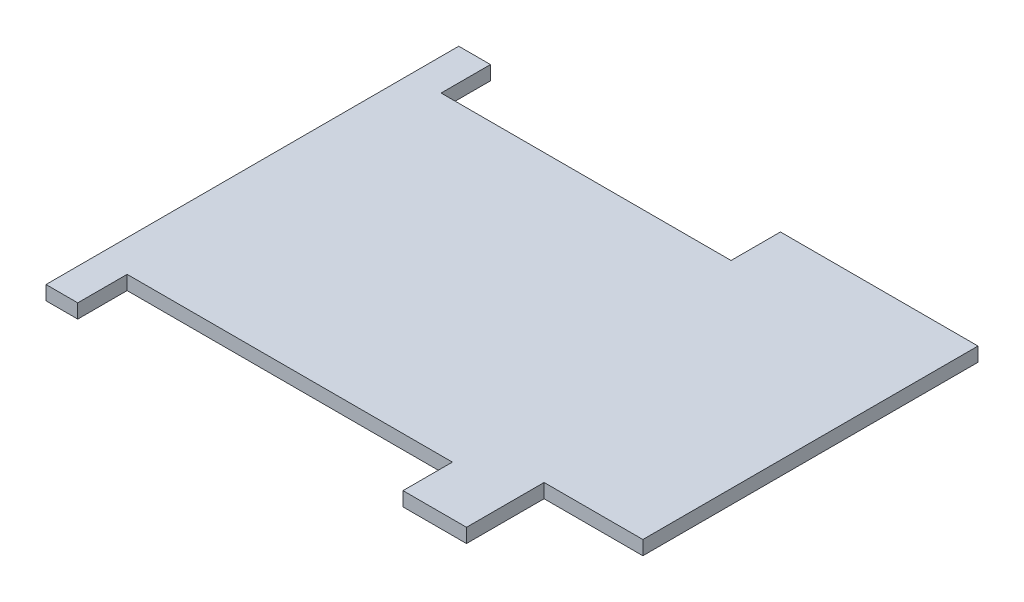
ISO-10303-21;
HEADER;
FILE_DESCRIPTION(('STEP AP214'),'2;1');
FILE_NAME('part.step','',(''),(''),'','','');
FILE_SCHEMA(('AUTOMOTIVE_DESIGN { 1 0 10303 214 1 1 1 1 }'));
ENDSEC;
DATA;
#1=APPLICATION_CONTEXT('core data for automotive mechanical design processes');
#2=APPLICATION_PROTOCOL_DEFINITION('international standard','automotive_design',2000,#1);
#3=PRODUCT_CONTEXT('',#1,'mechanical');
#4=PRODUCT('Part','Part','',(#3));
#5=PRODUCT_RELATED_PRODUCT_CATEGORY('part','',(#4));
#6=PRODUCT_DEFINITION_FORMATION('','',#4);
#7=PRODUCT_DEFINITION_CONTEXT('part definition',#1,'design');
#8=PRODUCT_DEFINITION('design','',#6,#7);
#9=PRODUCT_DEFINITION_SHAPE('','',#8);
#10=(LENGTH_UNIT() NAMED_UNIT(*) SI_UNIT(.MILLI.,.METRE.));
#11=(NAMED_UNIT(*) PLANE_ANGLE_UNIT() SI_UNIT($,.RADIAN.));
#12=(NAMED_UNIT(*) SI_UNIT($,.STERADIAN.) SOLID_ANGLE_UNIT());
#13=UNCERTAINTY_MEASURE_WITH_UNIT(LENGTH_MEASURE(1.E-05),#10,'distance_accuracy_value','');
#14=(GEOMETRIC_REPRESENTATION_CONTEXT(3) GLOBAL_UNCERTAINTY_ASSIGNED_CONTEXT((#13)) GLOBAL_UNIT_ASSIGNED_CONTEXT((#10,
#11,#12)) REPRESENTATION_CONTEXT('',''));
#15=CARTESIAN_POINT('',(0.,0.,0.));
#16=DIRECTION('',(0.,0.,1.));
#17=DIRECTION('',(1.,0.,0.));
#18=AXIS2_PLACEMENT_3D('',#15,#16,#17);
#19=CARTESIAN_POINT('',(0.,2.,58.5));
#20=DIRECTION('',(0.,0.,-1.));
#21=DIRECTION('',(-1.,0.,0.));
#22=AXIS2_PLACEMENT_3D('',#19,#20,#21);
#23=PLANE('',#22);
#24=DIRECTION('',(1.,0.,0.));
#25=VECTOR('',#24,1.);
#26=CARTESIAN_POINT('',(0.,0.,58.5));
#27=LINE('',#26,#25);
#28=CARTESIAN_POINT('',(0.,0.,58.5));
#29=VERTEX_POINT('',#28);
#30=CARTESIAN_POINT('',(4.50000000000001,0.,58.5));
#31=VERTEX_POINT('',#30);
#32=EDGE_CURVE('E151',#29,#31,#27,.T.);
#33=ORIENTED_EDGE('',*,*,#32,.T.);
#34=DIRECTION('',(0.,1.,0.));
#35=VECTOR('',#34,1.);
#36=CARTESIAN_POINT('',(4.50000000000001,0.,58.5));
#37=LINE('',#36,#35);
#38=CARTESIAN_POINT('',(4.50000000000001,2.,58.5));
#39=VERTEX_POINT('',#38);
#40=EDGE_CURVE('E137',#31,#39,#37,.T.);
#41=ORIENTED_EDGE('',*,*,#40,.T.);
#42=DIRECTION('',(1.,0.,0.));
#43=VECTOR('',#42,1.);
#44=CARTESIAN_POINT('',(0.,2.,58.5));
#45=LINE('',#44,#43);
#46=CARTESIAN_POINT('',(0.,2.,58.5));
#47=VERTEX_POINT('',#46);
#48=EDGE_CURVE('E219',#47,#39,#45,.T.);
#49=ORIENTED_EDGE('',*,*,#48,.F.);
#50=DIRECTION('',(0.,-1.,0.));
#51=VECTOR('',#50,1.);
#52=CARTESIAN_POINT('',(0.,2.,58.5));
#53=LINE('',#52,#51);
#54=EDGE_CURVE('E11',#47,#29,#53,.T.);
#55=ORIENTED_EDGE('',*,*,#54,.T.);
#56=EDGE_LOOP('',(#33,#41,#49,#55));
#57=FACE_BOUND('',#56,.T.);
#58=ADVANCED_FACE('F35',(#57),#23,.F.);
#59=CARTESIAN_POINT('',(0.,2.,0.));
#60=DIRECTION('',(0.,0.,1.));
#61=DIRECTION('',(1.,0.,0.));
#62=AXIS2_PLACEMENT_3D('',#59,#60,#61);
#63=PLANE('',#62);
#64=DIRECTION('',(-1.,0.,0.));
#65=VECTOR('',#64,1.);
#66=CARTESIAN_POINT('',(0.,2.,0.));
#67=LINE('',#66,#65);
#68=CARTESIAN_POINT('',(4.5,2.,0.));
#69=VERTEX_POINT('',#68);
#70=CARTESIAN_POINT('',(0.,2.,0.));
#71=VERTEX_POINT('',#70);
#72=EDGE_CURVE('E222',#69,#71,#67,.T.);
#73=ORIENTED_EDGE('',*,*,#72,.F.);
#74=DIRECTION('',(0.,1.,0.));
#75=VECTOR('',#74,1.);
#76=CARTESIAN_POINT('',(4.5,0.,0.));
#77=LINE('',#76,#75);
#78=CARTESIAN_POINT('',(4.5,0.,0.));
#79=VERTEX_POINT('',#78);
#80=EDGE_CURVE('E211',#79,#69,#77,.T.);
#81=ORIENTED_EDGE('',*,*,#80,.F.);
#82=DIRECTION('',(-1.,0.,0.));
#83=VECTOR('',#82,1.);
#84=CARTESIAN_POINT('',(0.,0.,0.));
#85=LINE('',#84,#83);
#86=CARTESIAN_POINT('',(0.,0.,0.));
#87=VERTEX_POINT('',#86);
#88=EDGE_CURVE('E161',#79,#87,#85,.T.);
#89=ORIENTED_EDGE('',*,*,#88,.T.);
#90=DIRECTION('',(0.,-1.,0.));
#91=VECTOR('',#90,1.);
#92=CARTESIAN_POINT('',(0.,2.,0.));
#93=LINE('',#92,#91);
#94=EDGE_CURVE('E171',#71,#87,#93,.T.);
#95=ORIENTED_EDGE('',*,*,#94,.F.);
#96=EDGE_LOOP('',(#73,#81,#89,#95));
#97=FACE_BOUND('',#96,.T.);
#98=ADVANCED_FACE('F233',(#97),#63,.F.);
#99=CARTESIAN_POINT('',(0.,2.,0.));
#100=DIRECTION('',(1.,0.,0.));
#101=DIRECTION('',(0.,0.,-1.));
#102=AXIS2_PLACEMENT_3D('',#99,#100,#101);
#103=PLANE('',#102);
#104=DIRECTION('',(0.,0.,1.));
#105=VECTOR('',#104,1.);
#106=CARTESIAN_POINT('',(0.,0.,0.));
#107=LINE('',#106,#105);
#108=EDGE_CURVE('E163',#87,#29,#107,.T.);
#109=ORIENTED_EDGE('',*,*,#108,.T.);
#110=ORIENTED_EDGE('',*,*,#54,.F.);
#111=DIRECTION('',(0.,0.,1.));
#112=VECTOR('',#111,1.);
#113=CARTESIAN_POINT('',(0.,2.,0.));
#114=LINE('',#113,#112);
#115=EDGE_CURVE('E170',#71,#47,#114,.T.);
#116=ORIENTED_EDGE('',*,*,#115,.F.);
#117=ORIENTED_EDGE('',*,*,#94,.T.);
#118=EDGE_LOOP('',(#109,#110,#116,#117));
#119=FACE_BOUND('',#118,.T.);
#120=ADVANCED_FACE('F37',(#119),#103,.F.);
#121=CARTESIAN_POINT('',(50.6,2.,58.5));
#122=VERTEX_POINT('',#121);
#123=CARTESIAN_POINT('',(59.6,2.,58.5));
#124=VERTEX_POINT('',#123);
#125=EDGE_CURVE('E218',#122,#124,#45,.T.);
#126=ORIENTED_EDGE('',*,*,#125,.F.);
#127=DIRECTION('',(0.,1.,0.));
#128=VECTOR('',#127,1.);
#129=CARTESIAN_POINT('',(50.6,0.,58.5));
#130=LINE('',#129,#128);
#131=CARTESIAN_POINT('',(50.6,0.,58.5));
#132=VERTEX_POINT('',#131);
#133=EDGE_CURVE('E146',#132,#122,#130,.T.);
#134=ORIENTED_EDGE('',*,*,#133,.F.);
#135=CARTESIAN_POINT('',(59.6,0.,58.5));
#136=VERTEX_POINT('',#135);
#137=EDGE_CURVE('E159',#132,#136,#27,.T.);
#138=ORIENTED_EDGE('',*,*,#137,.T.);
#139=DIRECTION('',(0.,1.,0.));
#140=VECTOR('',#139,1.);
#141=CARTESIAN_POINT('',(59.6,0.,58.5));
#142=LINE('',#141,#140);
#143=EDGE_CURVE('E206',#136,#124,#142,.T.);
#144=ORIENTED_EDGE('',*,*,#143,.T.);
#145=EDGE_LOOP('',(#126,#134,#138,#144));
#146=FACE_BOUND('',#145,.T.);
#147=ADVANCED_FACE('F272',(#146),#23,.F.);
#148=CARTESIAN_POINT('',(73.6,2.,0.));
#149=DIRECTION('',(-1.,0.,0.));
#150=DIRECTION('',(0.,0.,1.));
#151=AXIS2_PLACEMENT_3D('',#148,#149,#150);
#152=PLANE('',#151);
#153=DIRECTION('',(0.,0.,-1.));
#154=VECTOR('',#153,1.);
#155=CARTESIAN_POINT('',(73.6,2.,0.));
#156=LINE('',#155,#154);
#157=CARTESIAN_POINT('',(73.6,2.,47.5));
#158=VERTEX_POINT('',#157);
#159=CARTESIAN_POINT('',(73.6,2.,0.));
#160=VERTEX_POINT('',#159);
#161=EDGE_CURVE('E221',#158,#160,#156,.T.);
#162=ORIENTED_EDGE('',*,*,#161,.F.);
#163=DIRECTION('',(0.,1.,0.));
#164=VECTOR('',#163,1.);
#165=CARTESIAN_POINT('',(73.6,0.,47.5));
#166=LINE('',#165,#164);
#167=CARTESIAN_POINT('',(73.6,0.,47.5));
#168=VERTEX_POINT('',#167);
#169=EDGE_CURVE('E238',#168,#158,#166,.T.);
#170=ORIENTED_EDGE('',*,*,#169,.F.);
#171=DIRECTION('',(0.,0.,-1.));
#172=VECTOR('',#171,1.);
#173=CARTESIAN_POINT('',(73.6,0.,0.));
#174=LINE('',#173,#172);
#175=CARTESIAN_POINT('',(73.6,0.,0.));
#176=VERTEX_POINT('',#175);
#177=EDGE_CURVE('E158',#168,#176,#174,.T.);
#178=ORIENTED_EDGE('',*,*,#177,.T.);
#179=DIRECTION('',(0.,-1.,0.));
#180=VECTOR('',#179,1.);
#181=CARTESIAN_POINT('',(73.6,2.,0.));
#182=LINE('',#181,#180);
#183=EDGE_CURVE('E43',#160,#176,#182,.T.);
#184=ORIENTED_EDGE('',*,*,#183,.F.);
#185=EDGE_LOOP('',(#162,#170,#178,#184));
#186=FACE_BOUND('',#185,.T.);
#187=ADVANCED_FACE('F280',(#186),#152,.F.);
#188=CARTESIAN_POINT('',(45.6,0.,0.));
#189=VERTEX_POINT('',#188);
#190=EDGE_CURVE('E167',#176,#189,#85,.T.);
#191=ORIENTED_EDGE('',*,*,#190,.T.);
#192=DIRECTION('',(0.,1.,0.));
#193=VECTOR('',#192,1.);
#194=CARTESIAN_POINT('',(45.6,0.,0.));
#195=LINE('',#194,#193);
#196=CARTESIAN_POINT('',(45.6,2.,0.));
#197=VERTEX_POINT('',#196);
#198=EDGE_CURVE('E213',#189,#197,#195,.T.);
#199=ORIENTED_EDGE('',*,*,#198,.T.);
#200=EDGE_CURVE('E173',#160,#197,#67,.T.);
#201=ORIENTED_EDGE('',*,*,#200,.F.);
#202=ORIENTED_EDGE('',*,*,#183,.T.);
#203=EDGE_LOOP('',(#191,#199,#201,#202));
#204=FACE_BOUND('',#203,.T.);
#205=ADVANCED_FACE('F179',(#204),#63,.F.);
#206=CARTESIAN_POINT('',(0.,2.,0.));
#207=DIRECTION('',(0.,1.,0.));
#208=DIRECTION('',(0.,0.,1.));
#209=AXIS2_PLACEMENT_3D('',#206,#207,#208);
#210=PLANE('',#209);
#211=DIRECTION('',(0.,0.,1.));
#212=VECTOR('',#211,1.);
#213=CARTESIAN_POINT('',(4.50000000000001,2.,58.5));
#214=LINE('',#213,#212);
#215=CARTESIAN_POINT('',(4.50000000000001,2.,51.5));
#216=VERTEX_POINT('',#215);
#217=EDGE_CURVE('E142',#216,#39,#214,.T.);
#218=ORIENTED_EDGE('',*,*,#217,.F.);
#219=DIRECTION('',(-1.,0.,0.));
#220=VECTOR('',#219,1.);
#221=CARTESIAN_POINT('',(4.50000000000001,2.,51.5));
#222=LINE('',#221,#220);
#223=CARTESIAN_POINT('',(50.6,2.,51.5));
#224=VERTEX_POINT('',#223);
#225=EDGE_CURVE('E154',#224,#216,#222,.T.);
#226=ORIENTED_EDGE('',*,*,#225,.F.);
#227=DIRECTION('',(0.,0.,-1.));
#228=VECTOR('',#227,1.);
#229=CARTESIAN_POINT('',(50.6,2.,58.5));
#230=LINE('',#229,#228);
#231=EDGE_CURVE('E260',#122,#224,#230,.T.);
#232=ORIENTED_EDGE('',*,*,#231,.F.);
#233=ORIENTED_EDGE('',*,*,#125,.T.);
#234=DIRECTION('',(0.,0.,1.));
#235=VECTOR('',#234,1.);
#236=CARTESIAN_POINT('',(59.6,2.,58.5));
#237=LINE('',#236,#235);
#238=CARTESIAN_POINT('',(59.6,2.,47.5));
#239=VERTEX_POINT('',#238);
#240=EDGE_CURVE('E244',#239,#124,#237,.T.);
#241=ORIENTED_EDGE('',*,*,#240,.F.);
#242=DIRECTION('',(-1.,0.,0.));
#243=VECTOR('',#242,1.);
#244=CARTESIAN_POINT('',(73.6,2.,47.5));
#245=LINE('',#244,#243);
#246=EDGE_CURVE('E248',#158,#239,#245,.T.);
#247=ORIENTED_EDGE('',*,*,#246,.F.);
#248=ORIENTED_EDGE('',*,*,#161,.T.);
#249=ORIENTED_EDGE('',*,*,#200,.T.);
#250=DIRECTION('',(0.,0.,-1.));
#251=VECTOR('',#250,1.);
#252=CARTESIAN_POINT('',(45.6,2.,0.));
#253=LINE('',#252,#251);
#254=CARTESIAN_POINT('',(45.6,2.,7.));
#255=VERTEX_POINT('',#254);
#256=EDGE_CURVE('E209',#255,#197,#253,.T.);
#257=ORIENTED_EDGE('',*,*,#256,.F.);
#258=DIRECTION('',(1.,0.,0.));
#259=VECTOR('',#258,1.);
#260=CARTESIAN_POINT('',(4.5,2.,7.));
#261=LINE('',#260,#259);
#262=CARTESIAN_POINT('',(4.5,2.,7.));
#263=VERTEX_POINT('',#262);
#264=EDGE_CURVE('E205',#263,#255,#261,.T.);
#265=ORIENTED_EDGE('',*,*,#264,.F.);
#266=DIRECTION('',(0.,0.,1.));
#267=VECTOR('',#266,1.);
#268=CARTESIAN_POINT('',(4.5,2.,0.));
#269=LINE('',#268,#267);
#270=EDGE_CURVE('E202',#69,#263,#269,.T.);
#271=ORIENTED_EDGE('',*,*,#270,.F.);
#272=ORIENTED_EDGE('',*,*,#72,.T.);
#273=ORIENTED_EDGE('',*,*,#115,.T.);
#274=ORIENTED_EDGE('',*,*,#48,.T.);
#275=EDGE_LOOP('',(#218,#226,#232,#233,#241,#247,#248,#249,#257,#265,#271,#272,#273,#274));
#276=FACE_BOUND('',#275,.T.);
#277=ADVANCED_FACE('F228',(#276),#210,.T.);
#278=CARTESIAN_POINT('',(0.,0.,0.));
#279=DIRECTION('',(0.,1.,0.));
#280=DIRECTION('',(0.,0.,1.));
#281=AXIS2_PLACEMENT_3D('',#278,#279,#280);
#282=PLANE('',#281);
#283=DIRECTION('',(-1.,0.,0.));
#284=VECTOR('',#283,1.);
#285=CARTESIAN_POINT('',(4.50000000000001,0.,51.5));
#286=LINE('',#285,#284);
#287=CARTESIAN_POINT('',(50.6,0.,51.5));
#288=VERTEX_POINT('',#287);
#289=CARTESIAN_POINT('',(4.50000000000001,0.,51.5));
#290=VERTEX_POINT('',#289);
#291=EDGE_CURVE('E50',#288,#290,#286,.T.);
#292=ORIENTED_EDGE('',*,*,#291,.T.);
#293=DIRECTION('',(0.,0.,1.));
#294=VECTOR('',#293,1.);
#295=CARTESIAN_POINT('',(4.50000000000001,0.,58.5));
#296=LINE('',#295,#294);
#297=EDGE_CURVE('E140',#290,#31,#296,.T.);
#298=ORIENTED_EDGE('',*,*,#297,.T.);
#299=ORIENTED_EDGE('',*,*,#32,.F.);
#300=ORIENTED_EDGE('',*,*,#108,.F.);
#301=ORIENTED_EDGE('',*,*,#88,.F.);
#302=DIRECTION('',(0.,0.,1.));
#303=VECTOR('',#302,1.);
#304=CARTESIAN_POINT('',(4.5,0.,0.));
#305=LINE('',#304,#303);
#306=CARTESIAN_POINT('',(4.5,0.,7.));
#307=VERTEX_POINT('',#306);
#308=EDGE_CURVE('E198',#79,#307,#305,.T.);
#309=ORIENTED_EDGE('',*,*,#308,.T.);
#310=DIRECTION('',(1.,0.,0.));
#311=VECTOR('',#310,1.);
#312=CARTESIAN_POINT('',(4.5,0.,7.));
#313=LINE('',#312,#311);
#314=CARTESIAN_POINT('',(45.6,0.,7.));
#315=VERTEX_POINT('',#314);
#316=EDGE_CURVE('E191',#307,#315,#313,.T.);
#317=ORIENTED_EDGE('',*,*,#316,.T.);
#318=DIRECTION('',(0.,0.,-1.));
#319=VECTOR('',#318,1.);
#320=CARTESIAN_POINT('',(45.6,0.,0.));
#321=LINE('',#320,#319);
#322=EDGE_CURVE('E188',#315,#189,#321,.T.);
#323=ORIENTED_EDGE('',*,*,#322,.T.);
#324=ORIENTED_EDGE('',*,*,#190,.F.);
#325=ORIENTED_EDGE('',*,*,#177,.F.);
#326=DIRECTION('',(-1.,0.,0.));
#327=VECTOR('',#326,1.);
#328=CARTESIAN_POINT('',(73.6,0.,47.5));
#329=LINE('',#328,#327);
#330=CARTESIAN_POINT('',(59.6,0.,47.5));
#331=VERTEX_POINT('',#330);
#332=EDGE_CURVE('E247',#168,#331,#329,.T.);
#333=ORIENTED_EDGE('',*,*,#332,.T.);
#334=DIRECTION('',(0.,0.,1.));
#335=VECTOR('',#334,1.);
#336=CARTESIAN_POINT('',(59.6,0.,58.5));
#337=LINE('',#336,#335);
#338=EDGE_CURVE('E58',#331,#136,#337,.T.);
#339=ORIENTED_EDGE('',*,*,#338,.T.);
#340=ORIENTED_EDGE('',*,*,#137,.F.);
#341=DIRECTION('',(0.,0.,-1.));
#342=VECTOR('',#341,1.);
#343=CARTESIAN_POINT('',(50.6,0.,58.5));
#344=LINE('',#343,#342);
#345=EDGE_CURVE('E153',#132,#288,#344,.T.);
#346=ORIENTED_EDGE('',*,*,#345,.T.);
#347=EDGE_LOOP('',(#292,#298,#299,#300,#301,#309,#317,#323,#324,#325,#333,#339,#340,#346));
#348=FACE_BOUND('',#347,.T.);
#349=ADVANCED_FACE('F149',(#348),#282,.F.);
#350=CARTESIAN_POINT('',(4.5,0.,0.));
#351=DIRECTION('',(-1.,0.,0.));
#352=DIRECTION('',(0.,0.,1.));
#353=AXIS2_PLACEMENT_3D('',#350,#351,#352);
#354=PLANE('',#353);
#355=ORIENTED_EDGE('',*,*,#270,.T.);
#356=DIRECTION('',(0.,1.,0.));
#357=VECTOR('',#356,1.);
#358=CARTESIAN_POINT('',(4.5,0.,7.));
#359=LINE('',#358,#357);
#360=EDGE_CURVE('E194',#307,#263,#359,.T.);
#361=ORIENTED_EDGE('',*,*,#360,.F.);
#362=ORIENTED_EDGE('',*,*,#308,.F.);
#363=ORIENTED_EDGE('',*,*,#80,.T.);
#364=EDGE_LOOP('',(#355,#361,#362,#363));
#365=FACE_BOUND('',#364,.T.);
#366=ADVANCED_FACE('F298',(#365),#354,.F.);
#367=CARTESIAN_POINT('',(45.6,0.,0.));
#368=DIRECTION('',(1.,0.,0.));
#369=DIRECTION('',(0.,0.,-1.));
#370=AXIS2_PLACEMENT_3D('',#367,#368,#369);
#371=PLANE('',#370);
#372=ORIENTED_EDGE('',*,*,#256,.T.);
#373=ORIENTED_EDGE('',*,*,#198,.F.);
#374=ORIENTED_EDGE('',*,*,#322,.F.);
#375=DIRECTION('',(0.,1.,0.));
#376=VECTOR('',#375,1.);
#377=CARTESIAN_POINT('',(45.6,0.,7.));
#378=LINE('',#377,#376);
#379=EDGE_CURVE('E196',#315,#255,#378,.T.);
#380=ORIENTED_EDGE('',*,*,#379,.T.);
#381=EDGE_LOOP('',(#372,#373,#374,#380));
#382=FACE_BOUND('',#381,.T.);
#383=ADVANCED_FACE('F303',(#382),#371,.F.);
#384=CARTESIAN_POINT('',(4.5,0.,7.));
#385=DIRECTION('',(0.,0.,1.));
#386=DIRECTION('',(1.,0.,0.));
#387=AXIS2_PLACEMENT_3D('',#384,#385,#386);
#388=PLANE('',#387);
#389=ORIENTED_EDGE('',*,*,#264,.T.);
#390=ORIENTED_EDGE('',*,*,#379,.F.);
#391=ORIENTED_EDGE('',*,*,#316,.F.);
#392=ORIENTED_EDGE('',*,*,#360,.T.);
#393=EDGE_LOOP('',(#389,#390,#391,#392));
#394=FACE_BOUND('',#393,.T.);
#395=ADVANCED_FACE('F304',(#394),#388,.F.);
#396=CARTESIAN_POINT('',(59.6,0.,58.5));
#397=DIRECTION('',(-1.,0.,0.));
#398=DIRECTION('',(0.,0.,1.));
#399=AXIS2_PLACEMENT_3D('',#396,#397,#398);
#400=PLANE('',#399);
#401=ORIENTED_EDGE('',*,*,#240,.T.);
#402=ORIENTED_EDGE('',*,*,#143,.F.);
#403=ORIENTED_EDGE('',*,*,#338,.F.);
#404=DIRECTION('',(0.,1.,0.));
#405=VECTOR('',#404,1.);
#406=CARTESIAN_POINT('',(59.6,0.,47.5));
#407=LINE('',#406,#405);
#408=EDGE_CURVE('E240',#331,#239,#407,.T.);
#409=ORIENTED_EDGE('',*,*,#408,.T.);
#410=EDGE_LOOP('',(#401,#402,#403,#409));
#411=FACE_BOUND('',#410,.T.);
#412=ADVANCED_FACE('F276',(#411),#400,.F.);
#413=CARTESIAN_POINT('',(73.6,0.,47.5));
#414=DIRECTION('',(0.,0.,-1.));
#415=DIRECTION('',(-1.,0.,0.));
#416=AXIS2_PLACEMENT_3D('',#413,#414,#415);
#417=PLANE('',#416);
#418=ORIENTED_EDGE('',*,*,#246,.T.);
#419=ORIENTED_EDGE('',*,*,#408,.F.);
#420=ORIENTED_EDGE('',*,*,#332,.F.);
#421=ORIENTED_EDGE('',*,*,#169,.T.);
#422=EDGE_LOOP('',(#418,#419,#420,#421));
#423=FACE_BOUND('',#422,.T.);
#424=ADVANCED_FACE('F278',(#423),#417,.F.);
#425=CARTESIAN_POINT('',(4.50000000000001,0.,58.5));
#426=DIRECTION('',(-1.,0.,0.));
#427=DIRECTION('',(0.,0.,1.));
#428=AXIS2_PLACEMENT_3D('',#425,#426,#427);
#429=PLANE('',#428);
#430=ORIENTED_EDGE('',*,*,#217,.T.);
#431=ORIENTED_EDGE('',*,*,#40,.F.);
#432=ORIENTED_EDGE('',*,*,#297,.F.);
#433=DIRECTION('',(0.,1.,0.));
#434=VECTOR('',#433,1.);
#435=CARTESIAN_POINT('',(4.50000000000001,0.,51.5));
#436=LINE('',#435,#434);
#437=EDGE_CURVE('E251',#290,#216,#436,.T.);
#438=ORIENTED_EDGE('',*,*,#437,.T.);
#439=EDGE_LOOP('',(#430,#431,#432,#438));
#440=FACE_BOUND('',#439,.T.);
#441=ADVANCED_FACE('F139',(#440),#429,.F.);
#442=CARTESIAN_POINT('',(4.50000000000001,0.,51.5));
#443=DIRECTION('',(0.,0.,-1.));
#444=DIRECTION('',(-1.,0.,0.));
#445=AXIS2_PLACEMENT_3D('',#442,#443,#444);
#446=PLANE('',#445);
#447=ORIENTED_EDGE('',*,*,#225,.T.);
#448=ORIENTED_EDGE('',*,*,#437,.F.);
#449=ORIENTED_EDGE('',*,*,#291,.F.);
#450=DIRECTION('',(0.,1.,0.));
#451=VECTOR('',#450,1.);
#452=CARTESIAN_POINT('',(50.6,0.,51.5));
#453=LINE('',#452,#451);
#454=EDGE_CURVE('E255',#288,#224,#453,.T.);
#455=ORIENTED_EDGE('',*,*,#454,.T.);
#456=EDGE_LOOP('',(#447,#448,#449,#455));
#457=FACE_BOUND('',#456,.T.);
#458=ADVANCED_FACE('F316',(#457),#446,.F.);
#459=CARTESIAN_POINT('',(50.6,0.,58.5));
#460=DIRECTION('',(1.,0.,0.));
#461=DIRECTION('',(0.,0.,-1.));
#462=AXIS2_PLACEMENT_3D('',#459,#460,#461);
#463=PLANE('',#462);
#464=ORIENTED_EDGE('',*,*,#231,.T.);
#465=ORIENTED_EDGE('',*,*,#454,.F.);
#466=ORIENTED_EDGE('',*,*,#345,.F.);
#467=ORIENTED_EDGE('',*,*,#133,.T.);
#468=EDGE_LOOP('',(#464,#465,#466,#467));
#469=FACE_BOUND('',#468,.T.);
#470=ADVANCED_FACE('F268',(#469),#463,.F.);
#471=CLOSED_SHELL('',(#58,#98,#120,#147,#187,#205,#277,#349,#366,#383,#395,#412,#424,#441,#458,#470));
#472=MANIFOLD_SOLID_BREP('B2',#471);
#473=ADVANCED_BREP_SHAPE_REPRESENTATION('',(#18,#472),#14);
#474=SHAPE_DEFINITION_REPRESENTATION(#9,#473);
ENDSEC;
END-ISO-10303-21;
